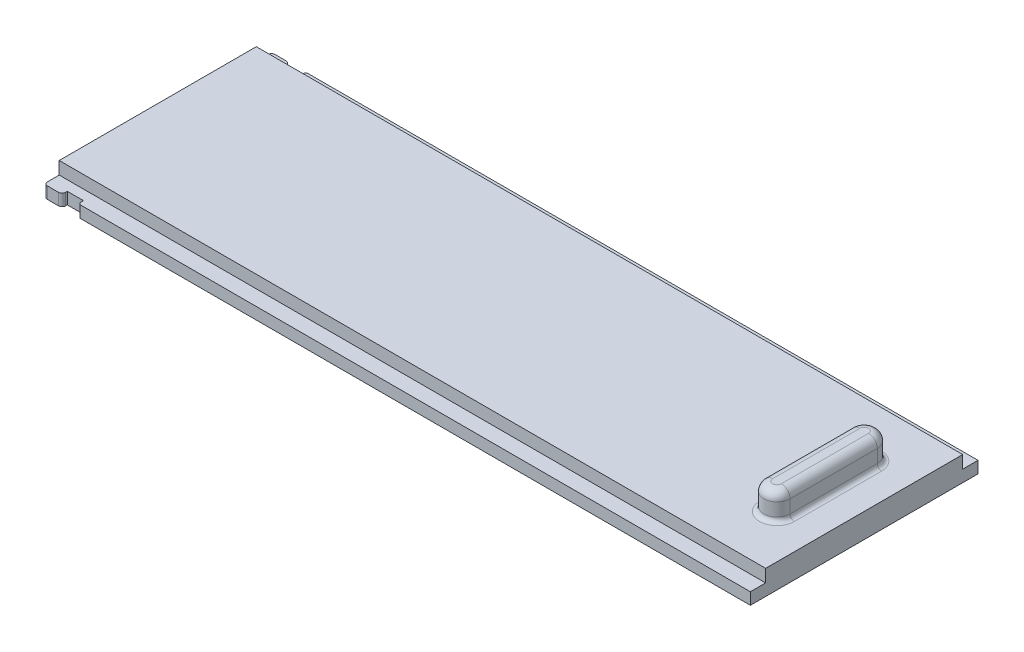
ISO-10303-21;
HEADER;
FILE_DESCRIPTION(('STEP AP214'),'2;1');
FILE_NAME('part.step','',(''),(''),'','','');
FILE_SCHEMA(('AUTOMOTIVE_DESIGN { 1 0 10303 214 1 1 1 1 }'));
ENDSEC;
DATA;
#1=APPLICATION_CONTEXT('core data for automotive mechanical design processes');
#2=APPLICATION_PROTOCOL_DEFINITION('international standard','automotive_design',2000,#1);
#3=PRODUCT_CONTEXT('',#1,'mechanical');
#4=PRODUCT('Part','Part','',(#3));
#5=PRODUCT_RELATED_PRODUCT_CATEGORY('part','',(#4));
#6=PRODUCT_DEFINITION_FORMATION('','',#4);
#7=PRODUCT_DEFINITION_CONTEXT('part definition',#1,'design');
#8=PRODUCT_DEFINITION('design','',#6,#7);
#9=PRODUCT_DEFINITION_SHAPE('','',#8);
#10=(LENGTH_UNIT() NAMED_UNIT(*) SI_UNIT(.MILLI.,.METRE.));
#11=(NAMED_UNIT(*) PLANE_ANGLE_UNIT() SI_UNIT($,.RADIAN.));
#12=(NAMED_UNIT(*) SI_UNIT($,.STERADIAN.) SOLID_ANGLE_UNIT());
#13=UNCERTAINTY_MEASURE_WITH_UNIT(LENGTH_MEASURE(1.E-05),#10,'distance_accuracy_value','');
#14=(GEOMETRIC_REPRESENTATION_CONTEXT(3) GLOBAL_UNCERTAINTY_ASSIGNED_CONTEXT((#13)) GLOBAL_UNIT_ASSIGNED_CONTEXT((#10,
#11,#12)) REPRESENTATION_CONTEXT('',''));
#15=CARTESIAN_POINT('',(0.,0.,0.));
#16=DIRECTION('',(0.,0.,1.));
#17=DIRECTION('',(1.,0.,0.));
#18=AXIS2_PLACEMENT_3D('',#15,#16,#17);
#19=CARTESIAN_POINT('',(0.,3.,0.));
#20=DIRECTION('',(0.,-1.,0.));
#21=DIRECTION('',(0.,0.,-1.));
#22=AXIS2_PLACEMENT_3D('',#19,#20,#21);
#23=PLANE('',#22);
#24=CARTESIAN_POINT('',(76.,3.,-9.49999999999999));
#25=DIRECTION('',(0.,-1.,0.));
#26=DIRECTION('',(0.,0.,-1.));
#27=AXIS2_PLACEMENT_3D('',#24,#25,#26);
#28=CIRCLE('',#27,2.);
#29=CARTESIAN_POINT('',(78.,3.,-9.49999999999999));
#30=VERTEX_POINT('',#29);
#31=CARTESIAN_POINT('',(74.,3.,-9.49999999999999));
#32=VERTEX_POINT('',#31);
#33=EDGE_CURVE('E388',#30,#32,#28,.T.);
#34=ORIENTED_EDGE('',*,*,#33,.T.);
#35=DIRECTION('',(0.,0.,1.));
#36=VECTOR('',#35,1.);
#37=CARTESIAN_POINT('',(74.,3.,-19.5));
#38=LINE('',#37,#36);
#39=CARTESIAN_POINT('',(74.,3.,-19.5));
#40=VERTEX_POINT('',#39);
#41=EDGE_CURVE('E394',#32,#40,#38,.F.);
#42=ORIENTED_EDGE('',*,*,#41,.T.);
#43=CARTESIAN_POINT('',(76.,3.,-19.5));
#44=DIRECTION('',(0.,-1.,0.));
#45=DIRECTION('',(0.,0.,-1.));
#46=AXIS2_PLACEMENT_3D('',#43,#44,#45);
#47=CIRCLE('',#46,2.);
#48=CARTESIAN_POINT('',(78.,3.,-19.5));
#49=VERTEX_POINT('',#48);
#50=EDGE_CURVE('E392',#40,#49,#47,.T.);
#51=ORIENTED_EDGE('',*,*,#50,.T.);
#52=DIRECTION('',(0.,0.,-1.));
#53=VECTOR('',#52,1.);
#54=CARTESIAN_POINT('',(78.,3.,-9.49999999999999));
#55=LINE('',#54,#53);
#56=EDGE_CURVE('E390',#49,#30,#55,.F.);
#57=ORIENTED_EDGE('',*,*,#56,.T.);
#58=EDGE_LOOP('',(#34,#42,#51,#57));
#59=FACE_BOUND('',#58,.T.);
#60=DIRECTION('',(0.,0.,-1.));
#61=VECTOR('',#60,1.);
#62=CARTESIAN_POINT('',(81.,3.,0.));
#63=LINE('',#62,#61);
#64=CARTESIAN_POINT('',(81.,3.,-3.2));
#65=VERTEX_POINT('',#64);
#66=CARTESIAN_POINT('',(81.,3.,-25.8));
#67=VERTEX_POINT('',#66);
#68=EDGE_CURVE('E303',#65,#67,#63,.T.);
#69=ORIENTED_EDGE('',*,*,#68,.T.);
#70=DIRECTION('',(1.,0.,0.));
#71=VECTOR('',#70,1.);
#72=CARTESIAN_POINT('',(-3.57805813256297,3.,-25.8));
#73=LINE('',#72,#71);
#74=CARTESIAN_POINT('',(0.,3.,-25.8));
#75=VERTEX_POINT('',#74);
#76=EDGE_CURVE('E267',#75,#67,#73,.T.);
#77=ORIENTED_EDGE('',*,*,#76,.F.);
#78=DIRECTION('',(0.,0.,1.));
#79=VECTOR('',#78,1.);
#80=CARTESIAN_POINT('',(0.,3.,0.));
#81=LINE('',#80,#79);
#82=CARTESIAN_POINT('',(0.,3.,-3.2));
#83=VERTEX_POINT('',#82);
#84=EDGE_CURVE('E300',#75,#83,#81,.T.);
#85=ORIENTED_EDGE('',*,*,#84,.T.);
#86=DIRECTION('',(1.,0.,0.));
#87=VECTOR('',#86,1.);
#88=CARTESIAN_POINT('',(-3.57805813256297,3.,-3.2));
#89=LINE('',#88,#87);
#90=EDGE_CURVE('E286',#83,#65,#89,.T.);
#91=ORIENTED_EDGE('',*,*,#90,.T.);
#92=EDGE_LOOP('',(#69,#77,#85,#91));
#93=FACE_BOUND('',#92,.T.);
#94=ADVANCED_FACE('F41',(#59,#93),#23,.F.);
#95=CARTESIAN_POINT('',(-3.57805813256297,0.,-27.55));
#96=DIRECTION('',(0.,0.,1.));
#97=DIRECTION('',(1.,0.,0.));
#98=AXIS2_PLACEMENT_3D('',#95,#96,#97);
#99=PLANE('',#98);
#100=DIRECTION('',(0.,-1.,0.));
#101=VECTOR('',#100,1.);
#102=CARTESIAN_POINT('',(81.,0.,-27.55));
#103=LINE('',#102,#101);
#104=CARTESIAN_POINT('',(81.,1.55,-27.55));
#105=VERTEX_POINT('',#104);
#106=CARTESIAN_POINT('',(81.,0.2,-27.55));
#107=VERTEX_POINT('',#106);
#108=EDGE_CURVE('E258',#105,#107,#103,.T.);
#109=ORIENTED_EDGE('',*,*,#108,.T.);
#110=DIRECTION('',(1.,0.,0.));
#111=VECTOR('',#110,1.);
#112=CARTESIAN_POINT('',(0.,0.2,-27.55));
#113=LINE('',#112,#111);
#114=CARTESIAN_POINT('',(4.125,0.2,-27.55));
#115=VERTEX_POINT('',#114);
#116=EDGE_CURVE('E239',#115,#107,#113,.T.);
#117=ORIENTED_EDGE('',*,*,#116,.F.);
#118=DIRECTION('',(0.,1.,0.));
#119=VECTOR('',#118,1.);
#120=CARTESIAN_POINT('',(4.125,0.,-27.55));
#121=LINE('',#120,#119);
#122=CARTESIAN_POINT('',(4.125,1.55,-27.55));
#123=VERTEX_POINT('',#122);
#124=EDGE_CURVE('E333',#115,#123,#121,.T.);
#125=ORIENTED_EDGE('',*,*,#124,.T.);
#126=DIRECTION('',(1.,0.,0.));
#127=VECTOR('',#126,1.);
#128=CARTESIAN_POINT('',(-3.57805813256297,1.55,-27.55));
#129=LINE('',#128,#127);
#130=EDGE_CURVE('E265',#123,#105,#129,.T.);
#131=ORIENTED_EDGE('',*,*,#130,.T.);
#132=EDGE_LOOP('',(#109,#117,#125,#131));
#133=FACE_BOUND('',#132,.T.);
#134=ADVANCED_FACE('F263',(#133),#99,.F.);
#135=CARTESIAN_POINT('',(-3.57805813256297,0.,-1.45));
#136=DIRECTION('',(0.,0.,-1.));
#137=DIRECTION('',(0.,1.,0.));
#138=AXIS2_PLACEMENT_3D('',#135,#136,#137);
#139=PLANE('',#138);
#140=DIRECTION('',(0.,-1.,0.));
#141=VECTOR('',#140,1.);
#142=CARTESIAN_POINT('',(4.12500000000001,0.,-1.45));
#143=LINE('',#142,#141);
#144=CARTESIAN_POINT('',(4.12500000000001,1.55,-1.45));
#145=VERTEX_POINT('',#144);
#146=CARTESIAN_POINT('',(4.12500000000001,0.2,-1.45));
#147=VERTEX_POINT('',#146);
#148=EDGE_CURVE('E319',#145,#147,#143,.T.);
#149=ORIENTED_EDGE('',*,*,#148,.T.);
#150=DIRECTION('',(-1.,0.,0.));
#151=VECTOR('',#150,1.);
#152=CARTESIAN_POINT('',(0.,0.2,-1.45));
#153=LINE('',#152,#151);
#154=CARTESIAN_POINT('',(81.,0.2,-1.45));
#155=VERTEX_POINT('',#154);
#156=EDGE_CURVE('E442',#155,#147,#153,.T.);
#157=ORIENTED_EDGE('',*,*,#156,.F.);
#158=DIRECTION('',(0.,1.,0.));
#159=VECTOR('',#158,1.);
#160=CARTESIAN_POINT('',(81.,0.,-1.45));
#161=LINE('',#160,#159);
#162=CARTESIAN_POINT('',(81.,1.55,-1.45));
#163=VERTEX_POINT('',#162);
#164=EDGE_CURVE('E260',#155,#163,#161,.T.);
#165=ORIENTED_EDGE('',*,*,#164,.T.);
#166=DIRECTION('',(1.,0.,0.));
#167=VECTOR('',#166,1.);
#168=CARTESIAN_POINT('',(-3.57805813256297,1.55,-1.45));
#169=LINE('',#168,#167);
#170=EDGE_CURVE('E283',#145,#163,#169,.T.);
#171=ORIENTED_EDGE('',*,*,#170,.F.);
#172=EDGE_LOOP('',(#149,#157,#165,#171));
#173=FACE_BOUND('',#172,.T.);
#174=ADVANCED_FACE('F558',(#173),#139,.F.);
#175=CARTESIAN_POINT('',(0.,3.,0.));
#176=DIRECTION('',(1.,0.,0.));
#177=DIRECTION('',(0.,0.,-1.));
#178=AXIS2_PLACEMENT_3D('',#175,#176,#177);
#179=PLANE('',#178);
#180=DIRECTION('',(0.,0.,1.));
#181=VECTOR('',#180,1.);
#182=CARTESIAN_POINT('',(0.,1.55,-27.55));
#183=LINE('',#182,#181);
#184=CARTESIAN_POINT('',(0.,1.55,-27.15));
#185=VERTEX_POINT('',#184);
#186=CARTESIAN_POINT('',(0.,1.55,-25.8));
#187=VERTEX_POINT('',#186);
#188=EDGE_CURVE('E304',#185,#187,#183,.T.);
#189=ORIENTED_EDGE('',*,*,#188,.F.);
#190=DIRECTION('',(0.,1.,0.));
#191=VECTOR('',#190,1.);
#192=CARTESIAN_POINT('',(0.,3.,-27.15));
#193=LINE('',#192,#191);
#194=CARTESIAN_POINT('',(0.,0.2,-27.15));
#195=VERTEX_POINT('',#194);
#196=EDGE_CURVE('E345',#185,#195,#193,.F.);
#197=ORIENTED_EDGE('',*,*,#196,.T.);
#198=DIRECTION('',(0.,0.,-1.));
#199=VECTOR('',#198,1.);
#200=CARTESIAN_POINT('',(0.,0.2,-27.55));
#201=LINE('',#200,#199);
#202=CARTESIAN_POINT('',(0.,0.2,-1.85000000000001));
#203=VERTEX_POINT('',#202);
#204=EDGE_CURVE('E251',#203,#195,#201,.T.);
#205=ORIENTED_EDGE('',*,*,#204,.F.);
#206=DIRECTION('',(0.,-1.,0.));
#207=VECTOR('',#206,1.);
#208=CARTESIAN_POINT('',(0.,3.,-1.85));
#209=LINE('',#208,#207);
#210=CARTESIAN_POINT('',(0.,1.55,-1.85));
#211=VERTEX_POINT('',#210);
#212=EDGE_CURVE('E343',#203,#211,#209,.F.);
#213=ORIENTED_EDGE('',*,*,#212,.T.);
#214=DIRECTION('',(0.,0.,1.));
#215=VECTOR('',#214,1.);
#216=CARTESIAN_POINT('',(0.,1.55,-1.45));
#217=LINE('',#216,#215);
#218=CARTESIAN_POINT('',(0.,1.55,-3.2));
#219=VERTEX_POINT('',#218);
#220=EDGE_CURVE('E289',#219,#211,#217,.T.);
#221=ORIENTED_EDGE('',*,*,#220,.F.);
#222=DIRECTION('',(0.,-1.,0.));
#223=VECTOR('',#222,1.);
#224=CARTESIAN_POINT('',(0.,1.55,-3.2));
#225=LINE('',#224,#223);
#226=EDGE_CURVE('E295',#83,#219,#225,.T.);
#227=ORIENTED_EDGE('',*,*,#226,.F.);
#228=ORIENTED_EDGE('',*,*,#84,.F.);
#229=DIRECTION('',(0.,1.,0.));
#230=VECTOR('',#229,1.);
#231=CARTESIAN_POINT('',(0.,1.55,-25.8));
#232=LINE('',#231,#230);
#233=EDGE_CURVE('E278',#187,#75,#232,.T.);
#234=ORIENTED_EDGE('',*,*,#233,.F.);
#235=EDGE_LOOP('',(#189,#197,#205,#213,#221,#227,#228,#234));
#236=FACE_BOUND('',#235,.T.);
#237=ADVANCED_FACE('F511',(#236),#179,.F.);
#238=CARTESIAN_POINT('',(81.,3.,0.));
#239=DIRECTION('',(-1.,0.,0.));
#240=DIRECTION('',(0.,0.,1.));
#241=AXIS2_PLACEMENT_3D('',#238,#239,#240);
#242=PLANE('',#241);
#243=ORIENTED_EDGE('',*,*,#164,.F.);
#244=DIRECTION('',(0.,0.,1.));
#245=VECTOR('',#244,1.);
#246=CARTESIAN_POINT('',(81.,0.2,-27.55));
#247=LINE('',#246,#245);
#248=EDGE_CURVE('E243',#107,#155,#247,.T.);
#249=ORIENTED_EDGE('',*,*,#248,.F.);
#250=ORIENTED_EDGE('',*,*,#108,.F.);
#251=DIRECTION('',(0.,0.,-1.));
#252=VECTOR('',#251,1.);
#253=CARTESIAN_POINT('',(81.,1.55,-27.55));
#254=LINE('',#253,#252);
#255=CARTESIAN_POINT('',(81.,1.55,-25.8));
#256=VERTEX_POINT('',#255);
#257=EDGE_CURVE('E268',#256,#105,#254,.T.);
#258=ORIENTED_EDGE('',*,*,#257,.F.);
#259=DIRECTION('',(0.,-1.,0.));
#260=VECTOR('',#259,1.);
#261=CARTESIAN_POINT('',(81.,1.55,-25.8));
#262=LINE('',#261,#260);
#263=EDGE_CURVE('E272',#67,#256,#262,.T.);
#264=ORIENTED_EDGE('',*,*,#263,.F.);
#265=ORIENTED_EDGE('',*,*,#68,.F.);
#266=DIRECTION('',(0.,1.,0.));
#267=VECTOR('',#266,1.);
#268=CARTESIAN_POINT('',(81.,1.55,-3.2));
#269=LINE('',#268,#267);
#270=CARTESIAN_POINT('',(81.,1.55,-3.2));
#271=VERTEX_POINT('',#270);
#272=EDGE_CURVE('E282',#271,#65,#269,.T.);
#273=ORIENTED_EDGE('',*,*,#272,.F.);
#274=DIRECTION('',(0.,0.,-1.));
#275=VECTOR('',#274,1.);
#276=CARTESIAN_POINT('',(81.,1.55,-1.45));
#277=LINE('',#276,#275);
#278=EDGE_CURVE('E291',#163,#271,#277,.T.);
#279=ORIENTED_EDGE('',*,*,#278,.F.);
#280=EDGE_LOOP('',(#243,#249,#250,#258,#264,#265,#273,#279));
#281=FACE_BOUND('',#280,.T.);
#282=ADVANCED_FACE('F256',(#281),#242,.F.);
#283=CARTESIAN_POINT('',(-3.57805813256297,1.55,-3.2));
#284=DIRECTION('',(0.,0.,-1.));
#285=DIRECTION('',(0.,1.,0.));
#286=AXIS2_PLACEMENT_3D('',#283,#284,#285);
#287=PLANE('',#286);
#288=ORIENTED_EDGE('',*,*,#226,.T.);
#289=DIRECTION('',(1.,0.,0.));
#290=VECTOR('',#289,1.);
#291=CARTESIAN_POINT('',(-3.57805813256297,1.55,-3.2));
#292=LINE('',#291,#290);
#293=EDGE_CURVE('E284',#219,#271,#292,.T.);
#294=ORIENTED_EDGE('',*,*,#293,.T.);
#295=ORIENTED_EDGE('',*,*,#272,.T.);
#296=ORIENTED_EDGE('',*,*,#90,.F.);
#297=EDGE_LOOP('',(#288,#294,#295,#296));
#298=FACE_BOUND('',#297,.T.);
#299=ADVANCED_FACE('F562',(#298),#287,.F.);
#300=CARTESIAN_POINT('',(-3.57805813256297,1.55,-1.45));
#301=DIRECTION('',(0.,-1.,0.));
#302=DIRECTION('',(0.,0.,-1.));
#303=AXIS2_PLACEMENT_3D('',#300,#301,#302);
#304=PLANE('',#303);
#305=ORIENTED_EDGE('',*,*,#220,.T.);
#306=CARTESIAN_POINT('',(0.4,1.55,-1.85));
#307=DIRECTION('',(0.,-1.,0.));
#308=DIRECTION('',(0.,0.,-1.));
#309=AXIS2_PLACEMENT_3D('',#306,#307,#308);
#310=CIRCLE('',#309,0.4);
#311=CARTESIAN_POINT('',(0.4,1.55,-1.45));
#312=VERTEX_POINT('',#311);
#313=EDGE_CURVE('E354',#211,#312,#310,.F.);
#314=ORIENTED_EDGE('',*,*,#313,.T.);
#315=CARTESIAN_POINT('',(1.675,1.55,-1.45));
#316=VERTEX_POINT('',#315);
#317=EDGE_CURVE('E280',#312,#316,#169,.T.);
#318=ORIENTED_EDGE('',*,*,#317,.T.);
#319=CARTESIAN_POINT('',(1.675,1.55,-1.85));
#320=DIRECTION('',(0.,-1.,0.));
#321=DIRECTION('',(0.,0.,-1.));
#322=AXIS2_PLACEMENT_3D('',#319,#320,#321);
#323=CIRCLE('',#322,0.4);
#324=CARTESIAN_POINT('',(2.075,1.55,-1.85));
#325=VERTEX_POINT('',#324);
#326=EDGE_CURVE('E313',#316,#325,#323,.F.);
#327=ORIENTED_EDGE('',*,*,#326,.T.);
#328=DIRECTION('',(0.,0.,1.));
#329=VECTOR('',#328,1.);
#330=CARTESIAN_POINT('',(2.075,1.55,-2.05));
#331=LINE('',#330,#329);
#332=CARTESIAN_POINT('',(2.075,1.55,-2.05));
#333=VERTEX_POINT('',#332);
#334=EDGE_CURVE('E297',#333,#325,#331,.T.);
#335=ORIENTED_EDGE('',*,*,#334,.F.);
#336=DIRECTION('',(-1.,0.,0.));
#337=VECTOR('',#336,1.);
#338=CARTESIAN_POINT('',(2.075,1.55,-2.05));
#339=LINE('',#338,#337);
#340=CARTESIAN_POINT('',(3.925,1.55,-2.05));
#341=VERTEX_POINT('',#340);
#342=EDGE_CURVE('E484',#341,#333,#339,.T.);
#343=ORIENTED_EDGE('',*,*,#342,.F.);
#344=DIRECTION('',(0.,0.,1.));
#345=VECTOR('',#344,1.);
#346=CARTESIAN_POINT('',(3.925,1.55,-2.05));
#347=LINE('',#346,#345);
#348=CARTESIAN_POINT('',(3.925,1.55,-1.65000000000001));
#349=VERTEX_POINT('',#348);
#350=EDGE_CURVE('E490',#341,#349,#347,.T.);
#351=ORIENTED_EDGE('',*,*,#350,.T.);
#352=DIRECTION('',(-0.707106781186548,0.,-0.707106781186548));
#353=VECTOR('',#352,1.);
#354=CARTESIAN_POINT('',(3.925,1.55,-1.65000000000001));
#355=LINE('',#354,#353);
#356=EDGE_CURVE('E317',#349,#145,#355,.F.);
#357=ORIENTED_EDGE('',*,*,#356,.T.);
#358=ORIENTED_EDGE('',*,*,#170,.T.);
#359=ORIENTED_EDGE('',*,*,#278,.T.);
#360=ORIENTED_EDGE('',*,*,#293,.F.);
#361=EDGE_LOOP('',(#305,#314,#318,#327,#335,#343,#351,#357,#358,#359,#360));
#362=FACE_BOUND('',#361,.T.);
#363=ADVANCED_FACE('F590',(#362),#304,.F.);
#364=ORIENTED_EDGE('',*,*,#317,.F.);
#365=DIRECTION('',(0.,-1.,0.));
#366=VECTOR('',#365,1.);
#367=CARTESIAN_POINT('',(0.4,0.,-1.45));
#368=LINE('',#367,#366);
#369=CARTESIAN_POINT('',(0.4,0.2,-1.45));
#370=VERTEX_POINT('',#369);
#371=EDGE_CURVE('E351',#312,#370,#368,.T.);
#372=ORIENTED_EDGE('',*,*,#371,.T.);
#373=CARTESIAN_POINT('',(1.675,0.2,-1.45));
#374=VERTEX_POINT('',#373);
#375=EDGE_CURVE('E261',#374,#370,#153,.T.);
#376=ORIENTED_EDGE('',*,*,#375,.F.);
#377=DIRECTION('',(0.,-1.,0.));
#378=VECTOR('',#377,1.);
#379=CARTESIAN_POINT('',(1.675,0.,-1.45));
#380=LINE('',#379,#378);
#381=EDGE_CURVE('E310',#374,#316,#380,.F.);
#382=ORIENTED_EDGE('',*,*,#381,.T.);
#383=EDGE_LOOP('',(#364,#372,#376,#382));
#384=FACE_BOUND('',#383,.T.);
#385=ADVANCED_FACE('F605',(#384),#139,.F.);
#386=CARTESIAN_POINT('',(0.4,0.2,-27.55));
#387=VERTEX_POINT('',#386);
#388=CARTESIAN_POINT('',(1.675,0.2,-27.55));
#389=VERTEX_POINT('',#388);
#390=EDGE_CURVE('E250',#387,#389,#113,.T.);
#391=ORIENTED_EDGE('',*,*,#390,.F.);
#392=DIRECTION('',(0.,1.,0.));
#393=VECTOR('',#392,1.);
#394=CARTESIAN_POINT('',(0.4,0.,-27.55));
#395=LINE('',#394,#393);
#396=CARTESIAN_POINT('',(0.4,1.55,-27.55));
#397=VERTEX_POINT('',#396);
#398=EDGE_CURVE('E338',#387,#397,#395,.T.);
#399=ORIENTED_EDGE('',*,*,#398,.T.);
#400=CARTESIAN_POINT('',(1.675,1.55,-27.55));
#401=VERTEX_POINT('',#400);
#402=EDGE_CURVE('E276',#397,#401,#129,.T.);
#403=ORIENTED_EDGE('',*,*,#402,.T.);
#404=DIRECTION('',(0.,1.,0.));
#405=VECTOR('',#404,1.);
#406=CARTESIAN_POINT('',(1.675,0.,-27.55));
#407=LINE('',#406,#405);
#408=EDGE_CURVE('E327',#401,#389,#407,.F.);
#409=ORIENTED_EDGE('',*,*,#408,.T.);
#410=EDGE_LOOP('',(#391,#399,#403,#409));
#411=FACE_BOUND('',#410,.T.);
#412=ADVANCED_FACE('F521',(#411),#99,.F.);
#413=CARTESIAN_POINT('',(-3.57805813256297,1.55,-27.55));
#414=DIRECTION('',(0.,-1.,0.));
#415=DIRECTION('',(0.,0.,-1.));
#416=AXIS2_PLACEMENT_3D('',#413,#414,#415);
#417=PLANE('',#416);
#418=ORIENTED_EDGE('',*,*,#402,.F.);
#419=CARTESIAN_POINT('',(0.4,1.55,-27.15));
#420=DIRECTION('',(0.,-1.,0.));
#421=DIRECTION('',(0.,0.,-1.));
#422=AXIS2_PLACEMENT_3D('',#419,#420,#421);
#423=CIRCLE('',#422,0.4);
#424=EDGE_CURVE('E341',#397,#185,#423,.F.);
#425=ORIENTED_EDGE('',*,*,#424,.T.);
#426=ORIENTED_EDGE('',*,*,#188,.T.);
#427=DIRECTION('',(1.,0.,0.));
#428=VECTOR('',#427,1.);
#429=CARTESIAN_POINT('',(-3.57805813256297,1.55,-25.8));
#430=LINE('',#429,#428);
#431=EDGE_CURVE('E270',#187,#256,#430,.T.);
#432=ORIENTED_EDGE('',*,*,#431,.T.);
#433=ORIENTED_EDGE('',*,*,#257,.T.);
#434=ORIENTED_EDGE('',*,*,#130,.F.);
#435=DIRECTION('',(0.707106781186548,0.,-0.707106781186548));
#436=VECTOR('',#435,1.);
#437=CARTESIAN_POINT('',(3.925,1.55,-27.35));
#438=LINE('',#437,#436);
#439=CARTESIAN_POINT('',(3.925,1.55,-27.35));
#440=VERTEX_POINT('',#439);
#441=EDGE_CURVE('E335',#123,#440,#438,.F.);
#442=ORIENTED_EDGE('',*,*,#441,.T.);
#443=DIRECTION('',(0.,0.,-1.));
#444=VECTOR('',#443,1.);
#445=CARTESIAN_POINT('',(3.925,1.55,-26.95));
#446=LINE('',#445,#444);
#447=CARTESIAN_POINT('',(3.925,1.55,-26.95));
#448=VERTEX_POINT('',#447);
#449=EDGE_CURVE('E477',#448,#440,#446,.T.);
#450=ORIENTED_EDGE('',*,*,#449,.F.);
#451=DIRECTION('',(1.,0.,0.));
#452=VECTOR('',#451,1.);
#453=CARTESIAN_POINT('',(2.075,1.55,-26.95));
#454=LINE('',#453,#452);
#455=CARTESIAN_POINT('',(2.075,1.55,-26.95));
#456=VERTEX_POINT('',#455);
#457=EDGE_CURVE('E473',#456,#448,#454,.T.);
#458=ORIENTED_EDGE('',*,*,#457,.F.);
#459=DIRECTION('',(0.,0.,-1.));
#460=VECTOR('',#459,1.);
#461=CARTESIAN_POINT('',(2.075,1.55,-26.95));
#462=LINE('',#461,#460);
#463=CARTESIAN_POINT('',(2.075,1.55,-27.15));
#464=VERTEX_POINT('',#463);
#465=EDGE_CURVE('E476',#456,#464,#462,.T.);
#466=ORIENTED_EDGE('',*,*,#465,.T.);
#467=CARTESIAN_POINT('',(1.675,1.55,-27.15));
#468=DIRECTION('',(0.,-1.,0.));
#469=DIRECTION('',(0.,0.,-1.));
#470=AXIS2_PLACEMENT_3D('',#467,#468,#469);
#471=CIRCLE('',#470,0.4);
#472=EDGE_CURVE('E324',#464,#401,#471,.F.);
#473=ORIENTED_EDGE('',*,*,#472,.T.);
#474=EDGE_LOOP('',(#418,#425,#426,#432,#433,#434,#442,#450,#458,#466,#473));
#475=FACE_BOUND('',#474,.T.);
#476=ADVANCED_FACE('F506',(#475),#417,.F.);
#477=CARTESIAN_POINT('',(-3.57805813256297,1.55,-25.8));
#478=DIRECTION('',(0.,0.,1.));
#479=DIRECTION('',(0.,-1.,0.));
#480=AXIS2_PLACEMENT_3D('',#477,#478,#479);
#481=PLANE('',#480);
#482=ORIENTED_EDGE('',*,*,#233,.T.);
#483=ORIENTED_EDGE('',*,*,#76,.T.);
#484=ORIENTED_EDGE('',*,*,#263,.T.);
#485=ORIENTED_EDGE('',*,*,#431,.F.);
#486=EDGE_LOOP('',(#482,#483,#484,#485));
#487=FACE_BOUND('',#486,.T.);
#488=ADVANCED_FACE('F500',(#487),#481,.F.);
#489=CARTESIAN_POINT('',(3.925,0.,-2.05));
#490=DIRECTION('',(1.,0.,0.));
#491=DIRECTION('',(0.,0.,-1.));
#492=AXIS2_PLACEMENT_3D('',#489,#490,#491);
#493=PLANE('',#492);
#494=DIRECTION('',(0.,1.,0.));
#495=VECTOR('',#494,1.);
#496=CARTESIAN_POINT('',(3.925,0.,-2.05));
#497=LINE('',#496,#495);
#498=CARTESIAN_POINT('',(3.925,0.2,-2.05));
#499=VERTEX_POINT('',#498);
#500=EDGE_CURVE('E480',#499,#341,#497,.T.);
#501=ORIENTED_EDGE('',*,*,#500,.F.);
#502=DIRECTION('',(0.,0.,1.));
#503=VECTOR('',#502,1.);
#504=CARTESIAN_POINT('',(3.925,0.2,-2.05));
#505=LINE('',#504,#503);
#506=CARTESIAN_POINT('',(3.925,0.2,-1.65000000000001));
#507=VERTEX_POINT('',#506);
#508=EDGE_CURVE('E457',#499,#507,#505,.T.);
#509=ORIENTED_EDGE('',*,*,#508,.T.);
#510=DIRECTION('',(0.,1.,0.));
#511=VECTOR('',#510,1.);
#512=CARTESIAN_POINT('',(3.925,0.,-1.65000000000001));
#513=LINE('',#512,#511);
#514=EDGE_CURVE('E315',#507,#349,#513,.T.);
#515=ORIENTED_EDGE('',*,*,#514,.T.);
#516=ORIENTED_EDGE('',*,*,#350,.F.);
#517=EDGE_LOOP('',(#501,#509,#515,#516));
#518=FACE_BOUND('',#517,.T.);
#519=ADVANCED_FACE('F618',(#518),#493,.F.);
#520=CARTESIAN_POINT('',(2.075,0.,-2.05));
#521=DIRECTION('',(-1.,0.,0.));
#522=DIRECTION('',(0.,0.,1.));
#523=AXIS2_PLACEMENT_3D('',#520,#521,#522);
#524=PLANE('',#523);
#525=DIRECTION('',(0.,-1.,0.));
#526=VECTOR('',#525,1.);
#527=CARTESIAN_POINT('',(2.075,0.,-1.85));
#528=LINE('',#527,#526);
#529=CARTESIAN_POINT('',(2.075,0.2,-1.85));
#530=VERTEX_POINT('',#529);
#531=EDGE_CURVE('E307',#325,#530,#528,.T.);
#532=ORIENTED_EDGE('',*,*,#531,.T.);
#533=DIRECTION('',(0.,0.,-1.));
#534=VECTOR('',#533,1.);
#535=CARTESIAN_POINT('',(2.075,0.2,-2.05));
#536=LINE('',#535,#534);
#537=CARTESIAN_POINT('',(2.075,0.2,-2.05));
#538=VERTEX_POINT('',#537);
#539=EDGE_CURVE('E463',#530,#538,#536,.T.);
#540=ORIENTED_EDGE('',*,*,#539,.T.);
#541=DIRECTION('',(0.,-1.,0.));
#542=VECTOR('',#541,1.);
#543=CARTESIAN_POINT('',(2.075,0.,-2.05));
#544=LINE('',#543,#542);
#545=EDGE_CURVE('E487',#333,#538,#544,.T.);
#546=ORIENTED_EDGE('',*,*,#545,.F.);
#547=ORIENTED_EDGE('',*,*,#334,.T.);
#548=EDGE_LOOP('',(#532,#540,#546,#547));
#549=FACE_BOUND('',#548,.T.);
#550=ADVANCED_FACE('F611',(#549),#524,.F.);
#551=CARTESIAN_POINT('',(0.,0.,-2.05));
#552=DIRECTION('',(0.,0.,-1.));
#553=DIRECTION('',(-1.,0.,0.));
#554=AXIS2_PLACEMENT_3D('',#551,#552,#553);
#555=PLANE('',#554);
#556=ORIENTED_EDGE('',*,*,#545,.T.);
#557=DIRECTION('',(1.,0.,0.));
#558=VECTOR('',#557,1.);
#559=CARTESIAN_POINT('',(0.,0.2,-2.05));
#560=LINE('',#559,#558);
#561=EDGE_CURVE('E460',#538,#499,#560,.T.);
#562=ORIENTED_EDGE('',*,*,#561,.T.);
#563=ORIENTED_EDGE('',*,*,#500,.T.);
#564=ORIENTED_EDGE('',*,*,#342,.T.);
#565=EDGE_LOOP('',(#556,#562,#563,#564));
#566=FACE_BOUND('',#565,.T.);
#567=ADVANCED_FACE('F571',(#566),#555,.F.);
#568=CARTESIAN_POINT('',(1.675,0.,-1.85));
#569=DIRECTION('',(0.,-1.,0.));
#570=DIRECTION('',(0.,0.,-1.));
#571=AXIS2_PLACEMENT_3D('',#568,#569,#570);
#572=CYLINDRICAL_SURFACE('',#571,0.4);
#573=CARTESIAN_POINT('',(1.675,0.2,-1.85));
#574=DIRECTION('',(0.,1.,0.));
#575=DIRECTION('',(0.,0.,1.));
#576=AXIS2_PLACEMENT_3D('',#573,#574,#575);
#577=CIRCLE('',#576,0.4);
#578=EDGE_CURVE('E466',#530,#374,#577,.F.);
#579=ORIENTED_EDGE('',*,*,#578,.F.);
#580=ORIENTED_EDGE('',*,*,#531,.F.);
#581=ORIENTED_EDGE('',*,*,#326,.F.);
#582=ORIENTED_EDGE('',*,*,#381,.F.);
#583=EDGE_LOOP('',(#579,#580,#581,#582));
#584=FACE_BOUND('',#583,.T.);
#585=ADVANCED_FACE('F567',(#584),#572,.T.);
#586=CARTESIAN_POINT('',(3.925,0.,-1.65000000000001));
#587=DIRECTION('',(0.707106781186548,0.,-0.707106781186548));
#588=DIRECTION('',(0.,1.,0.));
#589=AXIS2_PLACEMENT_3D('',#586,#587,#588);
#590=PLANE('',#589);
#591=DIRECTION('',(0.707106781186548,0.,0.707106781186548));
#592=VECTOR('',#591,1.);
#593=CARTESIAN_POINT('',(3.925,0.2,-1.65000000000001));
#594=LINE('',#593,#592);
#595=EDGE_CURVE('E455',#147,#507,#594,.F.);
#596=ORIENTED_EDGE('',*,*,#595,.F.);
#597=ORIENTED_EDGE('',*,*,#148,.F.);
#598=ORIENTED_EDGE('',*,*,#356,.F.);
#599=ORIENTED_EDGE('',*,*,#514,.F.);
#600=EDGE_LOOP('',(#596,#597,#598,#599));
#601=FACE_BOUND('',#600,.T.);
#602=ADVANCED_FACE('F570',(#601),#590,.F.);
#603=CARTESIAN_POINT('',(3.925,1.55,-26.95));
#604=DIRECTION('',(1.,0.,0.));
#605=DIRECTION('',(0.,0.,-1.));
#606=AXIS2_PLACEMENT_3D('',#603,#604,#605);
#607=PLANE('',#606);
#608=DIRECTION('',(0.,-1.,0.));
#609=VECTOR('',#608,1.);
#610=CARTESIAN_POINT('',(3.925,1.55,-27.35));
#611=LINE('',#610,#609);
#612=CARTESIAN_POINT('',(3.925,0.2,-27.35));
#613=VERTEX_POINT('',#612);
#614=EDGE_CURVE('E330',#440,#613,#611,.T.);
#615=ORIENTED_EDGE('',*,*,#614,.T.);
#616=DIRECTION('',(0.,0.,1.));
#617=VECTOR('',#616,1.);
#618=CARTESIAN_POINT('',(3.925,0.2,-26.95));
#619=LINE('',#618,#617);
#620=CARTESIAN_POINT('',(3.925,0.2,-26.95));
#621=VERTEX_POINT('',#620);
#622=EDGE_CURVE('E444',#613,#621,#619,.T.);
#623=ORIENTED_EDGE('',*,*,#622,.T.);
#624=DIRECTION('',(0.,-1.,0.));
#625=VECTOR('',#624,1.);
#626=CARTESIAN_POINT('',(3.925,1.55,-26.95));
#627=LINE('',#626,#625);
#628=EDGE_CURVE('E468',#448,#621,#627,.T.);
#629=ORIENTED_EDGE('',*,*,#628,.F.);
#630=ORIENTED_EDGE('',*,*,#449,.T.);
#631=EDGE_LOOP('',(#615,#623,#629,#630));
#632=FACE_BOUND('',#631,.T.);
#633=ADVANCED_FACE('F536',(#632),#607,.F.);
#634=CARTESIAN_POINT('',(2.075,1.55,-26.95));
#635=DIRECTION('',(-1.,0.,0.));
#636=DIRECTION('',(0.,0.,1.));
#637=AXIS2_PLACEMENT_3D('',#634,#635,#636);
#638=PLANE('',#637);
#639=DIRECTION('',(0.,1.,0.));
#640=VECTOR('',#639,1.);
#641=CARTESIAN_POINT('',(2.075,1.55,-26.95));
#642=LINE('',#641,#640);
#643=CARTESIAN_POINT('',(2.075,0.2,-26.95));
#644=VERTEX_POINT('',#643);
#645=EDGE_CURVE('E471',#644,#456,#642,.T.);
#646=ORIENTED_EDGE('',*,*,#645,.F.);
#647=DIRECTION('',(0.,0.,-1.));
#648=VECTOR('',#647,1.);
#649=CARTESIAN_POINT('',(2.075,0.2,-26.95));
#650=LINE('',#649,#648);
#651=CARTESIAN_POINT('',(2.075,0.2,-27.15));
#652=VERTEX_POINT('',#651);
#653=EDGE_CURVE('E450',#644,#652,#650,.T.);
#654=ORIENTED_EDGE('',*,*,#653,.T.);
#655=DIRECTION('',(0.,1.,0.));
#656=VECTOR('',#655,1.);
#657=CARTESIAN_POINT('',(2.075,1.55,-27.15));
#658=LINE('',#657,#656);
#659=EDGE_CURVE('E322',#652,#464,#658,.T.);
#660=ORIENTED_EDGE('',*,*,#659,.T.);
#661=ORIENTED_EDGE('',*,*,#465,.F.);
#662=EDGE_LOOP('',(#646,#654,#660,#661));
#663=FACE_BOUND('',#662,.T.);
#664=ADVANCED_FACE('F529',(#663),#638,.F.);
#665=CARTESIAN_POINT('',(0.,0.,-26.95));
#666=DIRECTION('',(0.,0.,1.));
#667=DIRECTION('',(1.,0.,0.));
#668=AXIS2_PLACEMENT_3D('',#665,#666,#667);
#669=PLANE('',#668);
#670=ORIENTED_EDGE('',*,*,#628,.T.);
#671=DIRECTION('',(-1.,0.,0.));
#672=VECTOR('',#671,1.);
#673=CARTESIAN_POINT('',(0.,0.2,-26.95));
#674=LINE('',#673,#672);
#675=EDGE_CURVE('E447',#621,#644,#674,.T.);
#676=ORIENTED_EDGE('',*,*,#675,.T.);
#677=ORIENTED_EDGE('',*,*,#645,.T.);
#678=ORIENTED_EDGE('',*,*,#457,.T.);
#679=EDGE_LOOP('',(#670,#676,#677,#678));
#680=FACE_BOUND('',#679,.T.);
#681=ADVANCED_FACE('F533',(#680),#669,.F.);
#682=CARTESIAN_POINT('',(1.675,1.55,-27.15));
#683=DIRECTION('',(0.,1.,0.));
#684=DIRECTION('',(0.,0.,1.));
#685=AXIS2_PLACEMENT_3D('',#682,#683,#684);
#686=CYLINDRICAL_SURFACE('',#685,0.4);
#687=CARTESIAN_POINT('',(1.675,0.2,-27.15));
#688=DIRECTION('',(0.,1.,0.));
#689=DIRECTION('',(0.,0.,1.));
#690=AXIS2_PLACEMENT_3D('',#687,#688,#689);
#691=CIRCLE('',#690,0.4);
#692=EDGE_CURVE('E453',#389,#652,#691,.F.);
#693=ORIENTED_EDGE('',*,*,#692,.F.);
#694=ORIENTED_EDGE('',*,*,#408,.F.);
#695=ORIENTED_EDGE('',*,*,#472,.F.);
#696=ORIENTED_EDGE('',*,*,#659,.F.);
#697=EDGE_LOOP('',(#693,#694,#695,#696));
#698=FACE_BOUND('',#697,.T.);
#699=ADVANCED_FACE('F525',(#698),#686,.T.);
#700=CARTESIAN_POINT('',(3.925,1.55,-27.35));
#701=DIRECTION('',(0.707106781186548,0.,0.707106781186548));
#702=DIRECTION('',(0.,-1.,0.));
#703=AXIS2_PLACEMENT_3D('',#700,#701,#702);
#704=PLANE('',#703);
#705=DIRECTION('',(-0.707106781186548,0.,0.707106781186548));
#706=VECTOR('',#705,1.);
#707=CARTESIAN_POINT('',(3.925,0.2,-27.35));
#708=LINE('',#707,#706);
#709=EDGE_CURVE('E246',#613,#115,#708,.F.);
#710=ORIENTED_EDGE('',*,*,#709,.F.);
#711=ORIENTED_EDGE('',*,*,#614,.F.);
#712=ORIENTED_EDGE('',*,*,#441,.F.);
#713=ORIENTED_EDGE('',*,*,#124,.F.);
#714=EDGE_LOOP('',(#710,#711,#712,#713));
#715=FACE_BOUND('',#714,.T.);
#716=ADVANCED_FACE('F539',(#715),#704,.F.);
#717=CARTESIAN_POINT('',(0.,0.2,0.));
#718=DIRECTION('',(0.,1.,0.));
#719=DIRECTION('',(0.,0.,1.));
#720=AXIS2_PLACEMENT_3D('',#717,#718,#719);
#721=PLANE('',#720);
#722=ORIENTED_EDGE('',*,*,#204,.T.);
#723=CARTESIAN_POINT('',(0.4,0.2,-27.15));
#724=DIRECTION('',(0.,1.,0.));
#725=DIRECTION('',(0.,0.,1.));
#726=AXIS2_PLACEMENT_3D('',#723,#724,#725);
#727=CIRCLE('',#726,0.4);
#728=EDGE_CURVE('E349',#195,#387,#727,.F.);
#729=ORIENTED_EDGE('',*,*,#728,.T.);
#730=ORIENTED_EDGE('',*,*,#390,.T.);
#731=ORIENTED_EDGE('',*,*,#692,.T.);
#732=ORIENTED_EDGE('',*,*,#653,.F.);
#733=ORIENTED_EDGE('',*,*,#675,.F.);
#734=ORIENTED_EDGE('',*,*,#622,.F.);
#735=ORIENTED_EDGE('',*,*,#709,.T.);
#736=ORIENTED_EDGE('',*,*,#116,.T.);
#737=ORIENTED_EDGE('',*,*,#248,.T.);
#738=ORIENTED_EDGE('',*,*,#156,.T.);
#739=ORIENTED_EDGE('',*,*,#595,.T.);
#740=ORIENTED_EDGE('',*,*,#508,.F.);
#741=ORIENTED_EDGE('',*,*,#561,.F.);
#742=ORIENTED_EDGE('',*,*,#539,.F.);
#743=ORIENTED_EDGE('',*,*,#578,.T.);
#744=ORIENTED_EDGE('',*,*,#375,.T.);
#745=CARTESIAN_POINT('',(0.4,0.2,-1.85));
#746=DIRECTION('',(0.,1.,0.));
#747=DIRECTION('',(0.,0.,1.));
#748=AXIS2_PLACEMENT_3D('',#745,#746,#747);
#749=CIRCLE('',#748,0.4);
#750=EDGE_CURVE('E347',#370,#203,#749,.F.);
#751=ORIENTED_EDGE('',*,*,#750,.T.);
#752=EDGE_LOOP('',(#722,#729,#730,#731,#732,#733,#734,#735,#736,#737,#738,#739,#740,#741,#742,
#743,#744,#751));
#753=FACE_BOUND('',#752,.T.);
#754=ADVANCED_FACE('F242',(#753),#721,.F.);
#755=CARTESIAN_POINT('',(0.4,0.,-27.15));
#756=DIRECTION('',(0.,1.,0.));
#757=DIRECTION('',(0.,0.,1.));
#758=AXIS2_PLACEMENT_3D('',#755,#756,#757);
#759=CYLINDRICAL_SURFACE('',#758,0.4);
#760=ORIENTED_EDGE('',*,*,#728,.F.);
#761=ORIENTED_EDGE('',*,*,#196,.F.);
#762=ORIENTED_EDGE('',*,*,#424,.F.);
#763=ORIENTED_EDGE('',*,*,#398,.F.);
#764=EDGE_LOOP('',(#760,#761,#762,#763));
#765=FACE_BOUND('',#764,.T.);
#766=ADVANCED_FACE('F516',(#765),#759,.T.);
#767=CARTESIAN_POINT('',(0.4,0.,-1.85));
#768=DIRECTION('',(0.,-1.,0.));
#769=DIRECTION('',(0.,0.,-1.));
#770=AXIS2_PLACEMENT_3D('',#767,#768,#769);
#771=CYLINDRICAL_SURFACE('',#770,0.4);
#772=ORIENTED_EDGE('',*,*,#313,.F.);
#773=ORIENTED_EDGE('',*,*,#212,.F.);
#774=ORIENTED_EDGE('',*,*,#750,.F.);
#775=ORIENTED_EDGE('',*,*,#371,.F.);
#776=EDGE_LOOP('',(#772,#773,#774,#775));
#777=FACE_BOUND('',#776,.T.);
#778=ADVANCED_FACE('F601',(#777),#771,.T.);
#779=CARTESIAN_POINT('',(76.,6.,-9.49999999999999));
#780=DIRECTION('',(0.,-1.,0.));
#781=DIRECTION('',(0.,0.,-1.));
#782=AXIS2_PLACEMENT_3D('',#779,#780,#781);
#783=CYLINDRICAL_SURFACE('',#782,1.5);
#784=DIRECTION('',(0.,-1.,0.));
#785=VECTOR('',#784,1.);
#786=CARTESIAN_POINT('',(74.5,6.,-9.49999999999999));
#787=LINE('',#786,#785);
#788=CARTESIAN_POINT('',(74.5,5.,-9.49999999999999));
#789=VERTEX_POINT('',#788);
#790=CARTESIAN_POINT('',(74.5,3.5,-9.49999999999999));
#791=VERTEX_POINT('',#790);
#792=EDGE_CURVE('E385',#789,#791,#787,.T.);
#793=ORIENTED_EDGE('',*,*,#792,.T.);
#794=CARTESIAN_POINT('',(76.,3.5,-9.49999999999999));
#795=DIRECTION('',(0.,-1.,0.));
#796=DIRECTION('',(0.,0.,-1.));
#797=AXIS2_PLACEMENT_3D('',#794,#795,#796);
#798=CIRCLE('',#797,1.5);
#799=CARTESIAN_POINT('',(77.5,3.5,-9.49999999999999));
#800=VERTEX_POINT('',#799);
#801=EDGE_CURVE('E11',#791,#800,#798,.F.);
#802=ORIENTED_EDGE('',*,*,#801,.T.);
#803=DIRECTION('',(0.,-1.,0.));
#804=VECTOR('',#803,1.);
#805=CARTESIAN_POINT('',(77.5,6.,-9.49999999999999));
#806=LINE('',#805,#804);
#807=CARTESIAN_POINT('',(77.5,5.,-9.49999999999999));
#808=VERTEX_POINT('',#807);
#809=EDGE_CURVE('E439',#808,#800,#806,.T.);
#810=ORIENTED_EDGE('',*,*,#809,.F.);
#811=CARTESIAN_POINT('',(76.,5.,-9.49999999999999));
#812=DIRECTION('',(0.,1.,0.));
#813=DIRECTION('',(0.,0.,1.));
#814=AXIS2_PLACEMENT_3D('',#811,#812,#813);
#815=CIRCLE('',#814,1.5);
#816=EDGE_CURVE('E372',#808,#789,#815,.F.);
#817=ORIENTED_EDGE('',*,*,#816,.T.);
#818=EDGE_LOOP('',(#793,#802,#810,#817));
#819=FACE_BOUND('',#818,.T.);
#820=ADVANCED_FACE('F432',(#819),#783,.T.);
#821=CARTESIAN_POINT('',(77.5,6.,-9.49999999999999));
#822=DIRECTION('',(-1.,0.,0.));
#823=DIRECTION('',(0.,0.,1.));
#824=AXIS2_PLACEMENT_3D('',#821,#822,#823);
#825=PLANE('',#824);
#826=ORIENTED_EDGE('',*,*,#809,.T.);
#827=DIRECTION('',(0.,0.,-1.));
#828=VECTOR('',#827,1.);
#829=CARTESIAN_POINT('',(77.5,3.5,-19.5));
#830=LINE('',#829,#828);
#831=CARTESIAN_POINT('',(77.5,3.5,-19.5));
#832=VERTEX_POINT('',#831);
#833=EDGE_CURVE('E50',#800,#832,#830,.T.);
#834=ORIENTED_EDGE('',*,*,#833,.T.);
#835=DIRECTION('',(0.,-1.,0.));
#836=VECTOR('',#835,1.);
#837=CARTESIAN_POINT('',(77.5,6.,-19.5));
#838=LINE('',#837,#836);
#839=CARTESIAN_POINT('',(77.5,5.,-19.5));
#840=VERTEX_POINT('',#839);
#841=EDGE_CURVE('E435',#840,#832,#838,.T.);
#842=ORIENTED_EDGE('',*,*,#841,.F.);
#843=DIRECTION('',(0.,0.,-1.));
#844=VECTOR('',#843,1.);
#845=CARTESIAN_POINT('',(77.5,5.,-9.49999999999999));
#846=LINE('',#845,#844);
#847=EDGE_CURVE('E370',#840,#808,#846,.F.);
#848=ORIENTED_EDGE('',*,*,#847,.T.);
#849=EDGE_LOOP('',(#826,#834,#842,#848));
#850=FACE_BOUND('',#849,.T.);
#851=ADVANCED_FACE('F800',(#850),#825,.F.);
#852=CARTESIAN_POINT('',(76.,6.,-19.5));
#853=DIRECTION('',(0.,-1.,0.));
#854=DIRECTION('',(0.,0.,-1.));
#855=AXIS2_PLACEMENT_3D('',#852,#853,#854);
#856=CYLINDRICAL_SURFACE('',#855,1.5);
#857=ORIENTED_EDGE('',*,*,#841,.T.);
#858=CARTESIAN_POINT('',(76.,3.5,-19.5));
#859=DIRECTION('',(0.,-1.,0.));
#860=DIRECTION('',(0.,0.,-1.));
#861=AXIS2_PLACEMENT_3D('',#858,#859,#860);
#862=CIRCLE('',#861,1.5);
#863=CARTESIAN_POINT('',(74.5,3.5,-19.5));
#864=VERTEX_POINT('',#863);
#865=EDGE_CURVE('E397',#832,#864,#862,.F.);
#866=ORIENTED_EDGE('',*,*,#865,.T.);
#867=DIRECTION('',(0.,-1.,0.));
#868=VECTOR('',#867,1.);
#869=CARTESIAN_POINT('',(74.5,6.,-19.5));
#870=LINE('',#869,#868);
#871=CARTESIAN_POINT('',(74.5,5.,-19.5));
#872=VERTEX_POINT('',#871);
#873=EDGE_CURVE('E431',#872,#864,#870,.T.);
#874=ORIENTED_EDGE('',*,*,#873,.F.);
#875=CARTESIAN_POINT('',(76.,5.,-19.5));
#876=DIRECTION('',(0.,1.,0.));
#877=DIRECTION('',(0.,0.,1.));
#878=AXIS2_PLACEMENT_3D('',#875,#876,#877);
#879=CIRCLE('',#878,1.5);
#880=EDGE_CURVE('E368',#872,#840,#879,.F.);
#881=ORIENTED_EDGE('',*,*,#880,.T.);
#882=EDGE_LOOP('',(#857,#866,#874,#881));
#883=FACE_BOUND('',#882,.T.);
#884=ADVANCED_FACE('F792',(#883),#856,.T.);
#885=CARTESIAN_POINT('',(74.5,6.,-9.49999999999999));
#886=DIRECTION('',(1.,0.,0.));
#887=DIRECTION('',(0.,0.,-1.));
#888=AXIS2_PLACEMENT_3D('',#885,#886,#887);
#889=PLANE('',#888);
#890=ORIENTED_EDGE('',*,*,#873,.T.);
#891=DIRECTION('',(0.,0.,1.));
#892=VECTOR('',#891,1.);
#893=CARTESIAN_POINT('',(74.5,3.5,-9.49999999999999));
#894=LINE('',#893,#892);
#895=EDGE_CURVE('E374',#864,#791,#894,.T.);
#896=ORIENTED_EDGE('',*,*,#895,.T.);
#897=ORIENTED_EDGE('',*,*,#792,.F.);
#898=DIRECTION('',(0.,0.,1.));
#899=VECTOR('',#898,1.);
#900=CARTESIAN_POINT('',(74.5,5.,-19.5));
#901=LINE('',#900,#899);
#902=EDGE_CURVE('E365',#789,#872,#901,.F.);
#903=ORIENTED_EDGE('',*,*,#902,.T.);
#904=EDGE_LOOP('',(#890,#896,#897,#903));
#905=FACE_BOUND('',#904,.T.);
#906=ADVANCED_FACE('F428',(#905),#889,.F.);
#907=CARTESIAN_POINT('',(76.,6.,-9.49999999999999));
#908=DIRECTION('',(0.,1.,0.));
#909=DIRECTION('',(0.,0.,1.));
#910=AXIS2_PLACEMENT_3D('',#907,#908,#909);
#911=PLANE('',#910);
#912=CARTESIAN_POINT('',(76.,6.,-19.5));
#913=DIRECTION('',(0.,1.,0.));
#914=DIRECTION('',(0.,0.,1.));
#915=AXIS2_PLACEMENT_3D('',#912,#913,#914);
#916=CIRCLE('',#915,0.500000000000001);
#917=CARTESIAN_POINT('',(76.5,6.,-19.5));
#918=VERTEX_POINT('',#917);
#919=CARTESIAN_POINT('',(75.5,6.,-19.5));
#920=VERTEX_POINT('',#919);
#921=EDGE_CURVE('E360',#918,#920,#916,.T.);
#922=ORIENTED_EDGE('',*,*,#921,.T.);
#923=DIRECTION('',(0.,0.,1.));
#924=VECTOR('',#923,1.);
#925=CARTESIAN_POINT('',(75.5,6.,-9.49999999999999));
#926=LINE('',#925,#924);
#927=CARTESIAN_POINT('',(75.5,6.,-9.49999999999999));
#928=VERTEX_POINT('',#927);
#929=EDGE_CURVE('E362',#920,#928,#926,.T.);
#930=ORIENTED_EDGE('',*,*,#929,.T.);
#931=CARTESIAN_POINT('',(76.,6.,-9.49999999999999));
#932=DIRECTION('',(0.,1.,0.));
#933=DIRECTION('',(0.,0.,1.));
#934=AXIS2_PLACEMENT_3D('',#931,#932,#933);
#935=CIRCLE('',#934,0.500000000000001);
#936=CARTESIAN_POINT('',(76.5,6.,-9.49999999999999));
#937=VERTEX_POINT('',#936);
#938=EDGE_CURVE('E356',#928,#937,#935,.T.);
#939=ORIENTED_EDGE('',*,*,#938,.T.);
#940=DIRECTION('',(0.,0.,-1.));
#941=VECTOR('',#940,1.);
#942=CARTESIAN_POINT('',(76.5,6.,-19.5));
#943=LINE('',#942,#941);
#944=EDGE_CURVE('E358',#937,#918,#943,.T.);
#945=ORIENTED_EDGE('',*,*,#944,.T.);
#946=EDGE_LOOP('',(#922,#930,#939,#945));
#947=FACE_BOUND('',#946,.T.);
#948=ADVANCED_FACE('F714',(#947),#911,.T.);
#949=CARTESIAN_POINT('',(76.5,5.,-9.49999999999999));
#950=DIRECTION('',(0.,0.,1.));
#951=DIRECTION('',(1.,0.,0.));
#952=AXIS2_PLACEMENT_3D('',#949,#950,#951);
#953=CYLINDRICAL_SURFACE('',#952,1.);
#954=CARTESIAN_POINT('',(76.5,5.,-9.49999999999999));
#955=DIRECTION('',(0.,0.,1.));
#956=DIRECTION('',(1.,0.,0.));
#957=AXIS2_PLACEMENT_3D('',#954,#955,#956);
#958=CIRCLE('',#957,1.);
#959=EDGE_CURVE('E379',#808,#937,#958,.T.);
#960=ORIENTED_EDGE('',*,*,#959,.F.);
#961=ORIENTED_EDGE('',*,*,#847,.F.);
#962=CARTESIAN_POINT('',(76.5,5.,-19.5));
#963=DIRECTION('',(0.,0.,-1.));
#964=DIRECTION('',(-1.,0.,0.));
#965=AXIS2_PLACEMENT_3D('',#962,#963,#964);
#966=CIRCLE('',#965,1.);
#967=EDGE_CURVE('E382',#918,#840,#966,.T.);
#968=ORIENTED_EDGE('',*,*,#967,.F.);
#969=ORIENTED_EDGE('',*,*,#944,.F.);
#970=EDGE_LOOP('',(#960,#961,#968,#969));
#971=FACE_BOUND('',#970,.T.);
#972=ADVANCED_FACE('F718',(#971),#953,.T.);
#973=CARTESIAN_POINT('',(76.,5.,-19.5));
#974=DIRECTION('',(0.,1.,0.));
#975=DIRECTION('',(0.,0.,1.));
#976=AXIS2_PLACEMENT_3D('',#973,#974,#975);
#977=DEGENERATE_TOROIDAL_SURFACE('',#976,0.500000000000001,1.,.T.);
#978=ORIENTED_EDGE('',*,*,#967,.T.);
#979=ORIENTED_EDGE('',*,*,#880,.F.);
#980=CARTESIAN_POINT('',(75.5,5.,-19.5));
#981=DIRECTION('',(0.,0.,1.));
#982=DIRECTION('',(1.,0.,0.));
#983=AXIS2_PLACEMENT_3D('',#980,#981,#982);
#984=CIRCLE('',#983,1.);
#985=EDGE_CURVE('E377',#920,#872,#984,.T.);
#986=ORIENTED_EDGE('',*,*,#985,.F.);
#987=ORIENTED_EDGE('',*,*,#921,.F.);
#988=EDGE_LOOP('',(#978,#979,#986,#987));
#989=FACE_BOUND('',#988,.T.);
#990=ADVANCED_FACE('F728',(#989),#977,.T.);
#991=CARTESIAN_POINT('',(76.,5.,-9.49999999999999));
#992=DIRECTION('',(0.,1.,0.));
#993=DIRECTION('',(0.,0.,1.));
#994=AXIS2_PLACEMENT_3D('',#991,#992,#993);
#995=DEGENERATE_TOROIDAL_SURFACE('',#994,0.500000000000001,1.,.T.);
#996=ORIENTED_EDGE('',*,*,#959,.T.);
#997=ORIENTED_EDGE('',*,*,#938,.F.);
#998=CARTESIAN_POINT('',(75.5,5.,-9.49999999999999));
#999=DIRECTION('',(0.,0.,-1.));
#1000=DIRECTION('',(-1.,0.,0.));
#1001=AXIS2_PLACEMENT_3D('',#998,#999,#1000);
#1002=CIRCLE('',#1001,1.);
#1003=EDGE_CURVE('E375',#789,#928,#1002,.T.);
#1004=ORIENTED_EDGE('',*,*,#1003,.F.);
#1005=ORIENTED_EDGE('',*,*,#816,.F.);
#1006=EDGE_LOOP('',(#996,#997,#1004,#1005));
#1007=FACE_BOUND('',#1006,.T.);
#1008=ADVANCED_FACE('F737',(#1007),#995,.T.);
#1009=CARTESIAN_POINT('',(75.5,5.,-9.49999999999999));
#1010=DIRECTION('',(0.,0.,-1.));
#1011=DIRECTION('',(-1.,0.,0.));
#1012=AXIS2_PLACEMENT_3D('',#1009,#1010,#1011);
#1013=CYLINDRICAL_SURFACE('',#1012,1.);
#1014=ORIENTED_EDGE('',*,*,#985,.T.);
#1015=ORIENTED_EDGE('',*,*,#902,.F.);
#1016=ORIENTED_EDGE('',*,*,#1003,.T.);
#1017=ORIENTED_EDGE('',*,*,#929,.F.);
#1018=EDGE_LOOP('',(#1014,#1015,#1016,#1017));
#1019=FACE_BOUND('',#1018,.T.);
#1020=ADVANCED_FACE('F745',(#1019),#1013,.T.);
#1021=CARTESIAN_POINT('',(78.,3.5,-9.49999999999999));
#1022=DIRECTION('',(0.,0.,1.));
#1023=DIRECTION('',(1.,0.,0.));
#1024=AXIS2_PLACEMENT_3D('',#1021,#1022,#1023);
#1025=CYLINDRICAL_SURFACE('',#1024,0.5);
#1026=CARTESIAN_POINT('',(78.,3.5,-9.49999999999999));
#1027=DIRECTION('',(0.,0.,-1.));
#1028=DIRECTION('',(-1.,0.,0.));
#1029=AXIS2_PLACEMENT_3D('',#1026,#1027,#1028);
#1030=CIRCLE('',#1029,0.5);
#1031=EDGE_CURVE('E403',#30,#800,#1030,.T.);
#1032=ORIENTED_EDGE('',*,*,#1031,.F.);
#1033=ORIENTED_EDGE('',*,*,#56,.F.);
#1034=CARTESIAN_POINT('',(78.,3.5,-19.5));
#1035=DIRECTION('',(0.,0.,1.));
#1036=DIRECTION('',(1.,0.,0.));
#1037=AXIS2_PLACEMENT_3D('',#1034,#1035,#1036);
#1038=CIRCLE('',#1037,0.5);
#1039=EDGE_CURVE('E45',#832,#49,#1038,.T.);
#1040=ORIENTED_EDGE('',*,*,#1039,.F.);
#1041=ORIENTED_EDGE('',*,*,#833,.F.);
#1042=EDGE_LOOP('',(#1032,#1033,#1040,#1041));
#1043=FACE_BOUND('',#1042,.T.);
#1044=ADVANCED_FACE('F43',(#1043),#1025,.F.);
#1045=CARTESIAN_POINT('',(76.,3.5,-19.5));
#1046=DIRECTION('',(0.,-1.,0.));
#1047=DIRECTION('',(0.,0.,-1.));
#1048=AXIS2_PLACEMENT_3D('',#1045,#1046,#1047);
#1049=TOROIDAL_SURFACE('',#1048,2.,0.5);
#1050=ORIENTED_EDGE('',*,*,#1039,.T.);
#1051=ORIENTED_EDGE('',*,*,#50,.F.);
#1052=CARTESIAN_POINT('',(74.,3.5,-19.5));
#1053=DIRECTION('',(0.,0.,-1.));
#1054=DIRECTION('',(-1.,0.,0.));
#1055=AXIS2_PLACEMENT_3D('',#1052,#1053,#1054);
#1056=CIRCLE('',#1055,0.5);
#1057=EDGE_CURVE('E402',#864,#40,#1056,.T.);
#1058=ORIENTED_EDGE('',*,*,#1057,.F.);
#1059=ORIENTED_EDGE('',*,*,#865,.F.);
#1060=EDGE_LOOP('',(#1050,#1051,#1058,#1059));
#1061=FACE_BOUND('',#1060,.T.);
#1062=ADVANCED_FACE('F413',(#1061),#1049,.F.);
#1063=CARTESIAN_POINT('',(76.,3.5,-9.49999999999999));
#1064=DIRECTION('',(0.,-1.,0.));
#1065=DIRECTION('',(0.,0.,-1.));
#1066=AXIS2_PLACEMENT_3D('',#1063,#1064,#1065);
#1067=TOROIDAL_SURFACE('',#1066,2.,0.5);
#1068=ORIENTED_EDGE('',*,*,#1031,.T.);
#1069=ORIENTED_EDGE('',*,*,#801,.F.);
#1070=CARTESIAN_POINT('',(74.,3.5,-9.49999999999999));
#1071=DIRECTION('',(0.,0.,1.));
#1072=DIRECTION('',(1.,0.,0.));
#1073=AXIS2_PLACEMENT_3D('',#1070,#1071,#1072);
#1074=CIRCLE('',#1073,0.5);
#1075=EDGE_CURVE('E400',#32,#791,#1074,.T.);
#1076=ORIENTED_EDGE('',*,*,#1075,.F.);
#1077=ORIENTED_EDGE('',*,*,#33,.F.);
#1078=EDGE_LOOP('',(#1068,#1069,#1076,#1077));
#1079=FACE_BOUND('',#1078,.T.);
#1080=ADVANCED_FACE('F424',(#1079),#1067,.F.);
#1081=CARTESIAN_POINT('',(74.,3.5,-9.49999999999999));
#1082=DIRECTION('',(0.,0.,-1.));
#1083=DIRECTION('',(-1.,0.,0.));
#1084=AXIS2_PLACEMENT_3D('',#1081,#1082,#1083);
#1085=CYLINDRICAL_SURFACE('',#1084,0.5);
#1086=ORIENTED_EDGE('',*,*,#1057,.T.);
#1087=ORIENTED_EDGE('',*,*,#41,.F.);
#1088=ORIENTED_EDGE('',*,*,#1075,.T.);
#1089=ORIENTED_EDGE('',*,*,#895,.F.);
#1090=EDGE_LOOP('',(#1086,#1087,#1088,#1089));
#1091=FACE_BOUND('',#1090,.T.);
#1092=ADVANCED_FACE('F422',(#1091),#1085,.F.);
#1093=CLOSED_SHELL('',(#94,#134,#174,#237,#282,#299,#363,#385,#412,#476,#488,#519,#550,#567,
#585,#602,#633,#664,#681,#699,#716,#754,#766,#778,#820,#851,#884,#906,#948,#972,#990,#1008,
#1020,#1044,#1062,#1080,#1092));
#1094=MANIFOLD_SOLID_BREP('B2',#1093);
#1095=ADVANCED_BREP_SHAPE_REPRESENTATION('',(#18,#1094),#14);
#1096=SHAPE_DEFINITION_REPRESENTATION(#9,#1095);
ENDSEC;
END-ISO-10303-21;
